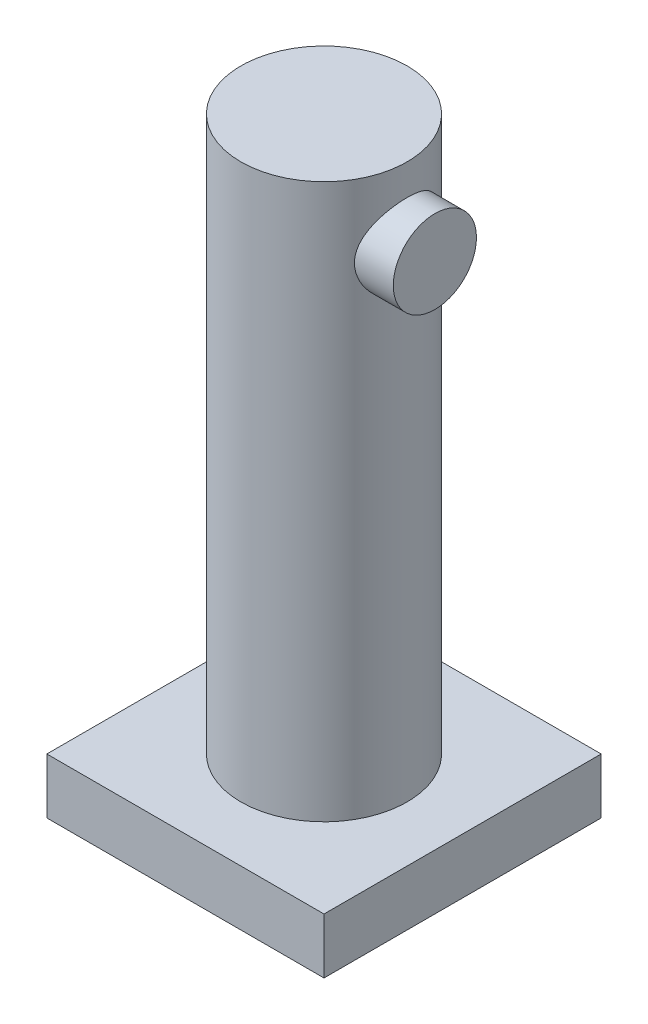
ISO-10303-21;
HEADER;
FILE_DESCRIPTION(('STEP AP214'),'2;1');
FILE_NAME('part.step','',(''),(''),'','','');
FILE_SCHEMA(('AUTOMOTIVE_DESIGN { 1 0 10303 214 1 1 1 1 }'));
ENDSEC;
DATA;
#1=APPLICATION_CONTEXT('core data for automotive mechanical design processes');
#2=APPLICATION_PROTOCOL_DEFINITION('international standard','automotive_design',2000,#1);
#3=PRODUCT_CONTEXT('',#1,'mechanical');
#4=PRODUCT('Part','Part','',(#3));
#5=PRODUCT_RELATED_PRODUCT_CATEGORY('part','',(#4));
#6=PRODUCT_DEFINITION_FORMATION('','',#4);
#7=PRODUCT_DEFINITION_CONTEXT('part definition',#1,'design');
#8=PRODUCT_DEFINITION('design','',#6,#7);
#9=PRODUCT_DEFINITION_SHAPE('','',#8);
#10=(LENGTH_UNIT() NAMED_UNIT(*) SI_UNIT(.MILLI.,.METRE.));
#11=(NAMED_UNIT(*) PLANE_ANGLE_UNIT() SI_UNIT($,.RADIAN.));
#12=(NAMED_UNIT(*) SI_UNIT($,.STERADIAN.) SOLID_ANGLE_UNIT());
#13=UNCERTAINTY_MEASURE_WITH_UNIT(LENGTH_MEASURE(1.E-05),#10,'distance_accuracy_value','');
#14=(GEOMETRIC_REPRESENTATION_CONTEXT(3) GLOBAL_UNCERTAINTY_ASSIGNED_CONTEXT((#13)) GLOBAL_UNIT_ASSIGNED_CONTEXT((#10,
#11,#12)) REPRESENTATION_CONTEXT('',''));
#15=CARTESIAN_POINT('',(0.,0.,0.));
#16=DIRECTION('',(0.,0.,1.));
#17=DIRECTION('',(1.,0.,0.));
#18=AXIS2_PLACEMENT_3D('',#15,#16,#17);
#19=CARTESIAN_POINT('',(0.,1100.,0.));
#20=DIRECTION('',(0.,-1.,0.));
#21=DIRECTION('',(0.,0.,-1.));
#22=AXIS2_PLACEMENT_3D('',#19,#20,#21);
#23=CYLINDRICAL_SURFACE('',#22,150.);
#24=CARTESIAN_POINT('',(0.,1100.,0.));
#25=DIRECTION('',(0.,1.,0.));
#26=DIRECTION('',(0.,0.,1.));
#27=AXIS2_PLACEMENT_3D('',#24,#25,#26);
#28=CIRCLE('',#27,150.);
#29=CARTESIAN_POINT('',(0.,1100.,150.));
#30=VERTEX_POINT('',#29);
#31=EDGE_CURVE('E111',#30,#30,#28,.T.);
#32=ORIENTED_EDGE('',*,*,#31,.F.);
#33=EDGE_LOOP('',(#32));
#34=FACE_BOUND('',#33,.T.);
#35=CARTESIAN_POINT('',(0.,100.,0.));
#36=DIRECTION('',(0.,1.,0.));
#37=DIRECTION('',(0.,0.,1.));
#38=AXIS2_PLACEMENT_3D('',#35,#36,#37);
#39=CIRCLE('',#38,150.);
#40=CARTESIAN_POINT('',(0.,100.,150.));
#41=VERTEX_POINT('',#40);
#42=EDGE_CURVE('E49',#41,#41,#39,.T.);
#43=ORIENTED_EDGE('',*,*,#42,.T.);
#44=EDGE_LOOP('',(#43));
#45=FACE_BOUND('',#44,.T.);
#46=CARTESIAN_POINT('',(129.903810567666,969.265591665348,75.));
#47=CARTESIAN_POINT('',(129.903811420839,968.288128942765,74.9999993006996));
#48=CARTESIAN_POINT('',(129.91485241894,967.310642365786,74.9808849071809));
#49=CARTESIAN_POINT('',(129.958914329319,965.357551628857,74.9044891493735));
#50=CARTESIAN_POINT('',(129.991937963204,964.381947716996,74.8472030591551));
#51=CARTESIAN_POINT('',(130.079664512874,962.434355564051,74.6946358539916));
#52=CARTESIAN_POINT('',(130.13437488093,961.462368681913,74.5993416781525));
#53=CARTESIAN_POINT('',(130.264962571577,959.524158889419,74.3710750303367));
#54=CARTESIAN_POINT('',(130.340842181223,958.55793661338,74.2380984872557));
#55=CARTESIAN_POINT('',(130.513207898603,956.631536287261,73.9346539235639));
#56=CARTESIAN_POINT('',(130.60972924554,955.671371501166,73.76412177368));
#57=CARTESIAN_POINT('',(130.822431351531,953.760420178277,73.3862278879793));
#58=CARTESIAN_POINT('',(130.938614186339,952.809634642922,73.1788622633673));
#59=CARTESIAN_POINT('',(131.189583523212,950.919364353117,72.7279846137554));
#60=CARTESIAN_POINT('',(131.324366065665,949.979877239551,72.4844802813395));
#61=CARTESIAN_POINT('',(131.611399522935,948.113491786094,71.9619913761846));
#62=CARTESIAN_POINT('',(131.763652185065,947.186594715811,71.6830032541549));
#63=CARTESIAN_POINT('',(132.243018022242,944.437005429077,70.7971366980788));
#64=CARTESIAN_POINT('',(132.594179272189,942.634747611969,70.138801162258));
#65=CARTESIAN_POINT('',(133.350018304579,939.095764729833,68.6908922584656));
#66=CARTESIAN_POINT('',(133.75469719945,937.359041027975,67.9013161624122));
#67=CARTESIAN_POINT('',(134.606257936416,933.95903166609,66.1971467617431));
#68=CARTESIAN_POINT('',(135.053136810067,932.295740852685,65.2825622484857));
#69=CARTESIAN_POINT('',(135.977643754193,929.049407385243,63.3343728211863));
#70=CARTESIAN_POINT('',(136.455273203206,927.46636833456,62.3007625696187));
#71=CARTESIAN_POINT('',(137.470149186955,924.259564023414,60.0302335597321));
#72=CARTESIAN_POINT('',(138.009063183983,922.643214350339,58.7835767196959));
#73=CARTESIAN_POINT('',(139.095560046539,919.519030956904,56.1643583824486));
#74=CARTESIAN_POINT('',(139.643143300329,918.011202113634,54.7917912329366));
#75=CARTESIAN_POINT('',(140.7336068061,915.110674223823,51.9268950431188));
#76=CARTESIAN_POINT('',(141.276484716471,913.718029849997,50.434509785529));
#77=CARTESIAN_POINT('',(142.344221581152,911.055933750404,47.3371372250203));
#78=CARTESIAN_POINT('',(142.869080004047,909.786485655826,45.7321466054791));
#79=CARTESIAN_POINT('',(143.650453834485,907.940300220463,43.1903343474534));
#80=CARTESIAN_POINT('',(143.918026622401,907.31645971735,42.290732937704));
#81=CARTESIAN_POINT('',(144.442562333303,906.107452590185,40.4629421299651));
#82=CARTESIAN_POINT('',(144.699526265663,905.522282283683,39.5347554664423));
#83=CARTESIAN_POINT('',(145.201087432756,904.391772239355,37.6509567952819));
#84=CARTESIAN_POINT('',(145.445682469921,903.846439571839,36.6953399611061));
#85=CARTESIAN_POINT('',(145.920690289304,902.797052237367,34.7583990954472));
#86=CARTESIAN_POINT('',(146.151104721666,902.292992765337,33.7770780740826));
#87=CARTESIAN_POINT('',(146.596025718433,901.327544651365,31.7905787334274));
#88=CARTESIAN_POINT('',(146.810537924642,900.866140861514,30.7854090438773));
#89=CARTESIAN_POINT('',(147.222130345961,899.987121180653,28.7527299066442));
#90=CARTESIAN_POINT('',(147.41921251679,899.569500376045,27.7252229814447));
#91=CARTESIAN_POINT('',(147.794471295791,898.779233588954,25.649685822657));
#92=CARTESIAN_POINT('',(147.972648369052,898.406586500031,24.6016560947066));
#93=CARTESIAN_POINT('',(148.308716863825,897.707437105241,22.4871176814895));
#94=CARTESIAN_POINT('',(148.466608671208,897.380933921604,21.4206093481643));
#95=CARTESIAN_POINT('',(148.750387003373,896.796715065084,19.3478027565578));
#96=CARTESIAN_POINT('',(148.87775136481,896.53575811875,18.3426191770829));
#97=CARTESIAN_POINT('',(149.113010819645,896.055388391094,16.3201223868786));
#98=CARTESIAN_POINT('',(149.220906207034,895.83597498244,15.3028093595579));
#99=CARTESIAN_POINT('',(149.416458567462,895.439391351264,13.2580792917326));
#100=CARTESIAN_POINT('',(149.504116103442,895.26221995372,12.2306625331057));
#101=CARTESIAN_POINT('',(149.658564083112,894.95069337492,10.1677924046223));
#102=CARTESIAN_POINT('',(149.725354479558,894.816338290603,9.13233901657573));
#103=CARTESIAN_POINT('',(149.837551172509,894.590955462637,7.05609999313428));
#104=CARTESIAN_POINT('',(149.882968213649,894.499905948527,6.01531730343289));
#105=CARTESIAN_POINT('',(149.952132861187,894.361347748468,3.93014213509433));
#106=CARTESIAN_POINT('',(149.97588057838,894.313838839897,2.88574967494128));
#107=CARTESIAN_POINT('',(150.001530428331,894.262527581539,0.795674738534314));
#108=CARTESIAN_POINT('',(150.003433604668,894.25872314386,-0.250007673707879));
#109=CARTESIAN_POINT('',(149.985382365556,894.294829497401,-2.3404156093167));
#110=CARTESIAN_POINT('',(149.965428367805,894.334739453226,-3.38514115058755));
#111=CARTESIAN_POINT('',(149.906499256737,894.45275283254,-5.38043204267112));
#112=CARTESIAN_POINT('',(149.869333498736,894.52722434949,-6.33126819770666));
#113=CARTESIAN_POINT('',(149.777140386739,894.712266941762,-8.22863180203203));
#114=CARTESIAN_POINT('',(149.722111615499,894.822840881437,-9.17515890339955));
#115=CARTESIAN_POINT('',(149.594539236115,895.079753419329,-11.0619980855576));
#116=CARTESIAN_POINT('',(149.52199847742,895.226086199122,-12.0023111519133));
#117=CARTESIAN_POINT('',(149.359829218643,895.554134607005,-13.8753447133122));
#118=CARTESIAN_POINT('',(149.270199105207,895.735853575835,-14.8080644828192));
#119=CARTESIAN_POINT('',(149.074392749456,896.134170997263,-16.6642171670034));
#120=CARTESIAN_POINT('',(148.968217637661,896.350767066745,-17.5876507116218));
#121=CARTESIAN_POINT('',(148.739945793449,896.818280294868,-19.4238262458942));
#122=CARTESIAN_POINT('',(148.617847593981,897.069200616032,-20.3365672419495));
#123=CARTESIAN_POINT('',(148.228710708302,897.87251482123,-23.0564746606206));
#124=CARTESIAN_POINT('',(147.93878561801,898.475551004323,-24.8457393914578));
#125=CARTESIAN_POINT('',(147.300152780169,899.820006322564,-28.3893046422761));
#126=CARTESIAN_POINT('',(146.950691055711,900.563215480683,-30.1427852443822));
#127=CARTESIAN_POINT('',(146.20357661752,902.176124740693,-33.5798586506784));
#128=CARTESIAN_POINT('',(145.805923961518,903.045824691051,-35.2634515385892));
#129=CARTESIAN_POINT('',(144.970832489177,904.905413428432,-38.5530636142519));
#130=CARTESIAN_POINT('',(144.533383364195,905.895333378901,-40.1590625366288));
#131=CARTESIAN_POINT('',(143.627848069227,907.988766948573,-43.2861572115245));
#132=CARTESIAN_POINT('',(143.159760205026,909.092286851386,-44.8072482603084));
#133=CARTESIAN_POINT('',(142.1572050138,911.516122456239,-47.8979343053814));
#134=CARTESIAN_POINT('',(141.62064630425,912.84707114549,-49.4585147702465));
#135=CARTESIAN_POINT('',(140.535165645227,915.630024497265,-52.4635033765368));
#136=CARTESIAN_POINT('',(139.986242993609,917.082036047628,-53.9079048987942));
#137=CARTESIAN_POINT('',(139.163709531499,919.345331178502,-55.9822883362665));
#138=CARTESIAN_POINT('',(138.889541685707,920.114366631124,-56.6586830471435));
#139=CARTESIAN_POINT('',(138.343269117666,921.679898276794,-57.9797425094769));
#140=CARTESIAN_POINT('',(138.071164231567,922.476392260477,-58.6244098036937));
#141=CARTESIAN_POINT('',(137.530797273352,924.095880760468,-59.8811124923251));
#142=CARTESIAN_POINT('',(137.262534894755,924.91887314605,-60.493150499989));
#143=CARTESIAN_POINT('',(136.731559778616,926.590681172206,-61.6839180695288));
#144=CARTESIAN_POINT('',(136.468848785427,927.439504730861,-62.2626372576679));
#145=CARTESIAN_POINT('',(135.658951143713,930.132456511824,-64.0185790631111));
#146=CARTESIAN_POINT('',(135.124751332001,932.020434099893,-65.1354642285907));
#147=CARTESIAN_POINT('',(134.107808540743,935.897922524617,-67.2043585944111));
#148=CARTESIAN_POINT('',(133.625061047661,937.887424432604,-68.1563822614322));
#149=CARTESIAN_POINT('',(132.952969847713,940.937574762758,-69.4531802579167));
#150=CARTESIAN_POINT('',(132.737646309605,941.965077359213,-69.8635092622733));
#151=CARTESIAN_POINT('',(132.326389703009,944.040462828172,-70.6393619278462));
#152=CARTESIAN_POINT('',(132.130451682431,945.088340413557,-71.0048970375225));
#153=CARTESIAN_POINT('',(131.759961913644,947.202704647578,-71.6900559665243));
#154=CARTESIAN_POINT('',(131.585409988262,948.269191141963,-72.0096801662052));
#155=CARTESIAN_POINT('',(131.259574101318,950.418728504402,-72.601918051135));
#156=CARTESIAN_POINT('',(131.108291175863,951.501780107696,-72.8745296431044));
#157=CARTESIAN_POINT('',(130.841722462814,953.595633336409,-73.3519757159068));
#158=CARTESIAN_POINT('',(130.724534204456,954.605359926808,-73.5604690504886));
#159=CARTESIAN_POINT('',(130.512520108222,956.634825878114,-73.9359765136339));
#160=CARTESIAN_POINT('',(130.417693934821,957.65456508855,-74.10299126455));
#161=CARTESIAN_POINT('',(130.251384466566,959.701906109247,-74.3949264518121));
#162=CARTESIAN_POINT('',(130.179900229588,960.729507600457,-74.5198485870971));
#163=CARTESIAN_POINT('',(130.061023832229,962.790394754196,-74.7271327674957));
#164=CARTESIAN_POINT('',(130.013631829819,963.823680453951,-74.8094945335443));
#165=CARTESIAN_POINT('',(129.943471564768,965.89299178965,-74.9312961505146));
#166=CARTESIAN_POINT('',(129.920688525537,966.929015406505,-74.9707617587655));
#167=CARTESIAN_POINT('',(129.899943048912,969.002054134476,-75.0067012424489));
#168=CARTESIAN_POINT('',(129.901980512932,970.039069241638,-75.0031752886427));
#169=CARTESIAN_POINT('',(129.930852425072,972.11165447273,-74.9531481105804));
#170=CARTESIAN_POINT('',(129.957685483489,973.147224674384,-74.9066492947967));
#171=CARTESIAN_POINT('',(130.035856139081,975.214608962457,-74.7708650971796));
#172=CARTESIAN_POINT('',(130.087193159424,976.246423136718,-74.6815807225323));
#173=CARTESIAN_POINT('',(130.206873168457,978.19116151631,-74.472699311696));
#174=CARTESIAN_POINT('',(130.272733905569,979.104715178319,-74.3575000933917));
#175=CARTESIAN_POINT('',(130.422894152729,980.925549265592,-74.0938034081047));
#176=CARTESIAN_POINT('',(130.507195058801,981.832829210533,-73.9453034200474));
#177=CARTESIAN_POINT('',(130.693532055843,983.639397997169,-73.6154642483153));
#178=CARTESIAN_POINT('',(130.79556490701,984.538688267163,-73.4341310633429));
#179=CARTESIAN_POINT('',(131.016560216568,986.328061578128,-73.0391126989387));
#180=CARTESIAN_POINT('',(131.135524233461,987.218143763403,-72.8254245411415));
#181=CARTESIAN_POINT('',(131.516512464333,989.872814834799,-72.1365629868607));
#182=CARTESIAN_POINT('',(131.802634679431,991.621845620061,-71.6135893253243));
#183=CARTESIAN_POINT('',(132.43070201112,995.067994449193,-70.4453554172057));
#184=CARTESIAN_POINT('',(132.772650533281,996.765109318533,-69.8000877099362));
#185=CARTESIAN_POINT('',(133.520064909555,1000.17682588851,-68.3599319288952));
#186=CARTESIAN_POINT('',(133.92773684509,1001.88860675861,-67.5595045926732));
#187=CARTESIAN_POINT('',(134.783033357614,1005.23906352991,-65.8366047099076));
#188=CARTESIAN_POINT('',(135.230658545203,1006.87773831326,-64.9141302980323));
#189=CARTESIAN_POINT('',(136.154877893386,1010.07607815055,-62.9525604899462));
#190=CARTESIAN_POINT('',(136.631483886747,1011.6357104487,-61.9134173096916));
#191=CARTESIAN_POINT('',(137.602460956672,1014.66936708995,-59.7243379130611));
#192=CARTESIAN_POINT('',(138.096833163871,1016.14338596897,-58.5743946375455));
#193=CARTESIAN_POINT('',(139.155394000352,1019.18049377093,-56.017181648615));
#194=CARTESIAN_POINT('',(139.720522310331,1020.73136001164,-54.5957503830836));
#195=CARTESIAN_POINT('',(140.844719819651,1023.70947864615,-51.6263984772894));
#196=CARTESIAN_POINT('',(141.403788548905,1025.13672150876,-50.0784681019732));
#197=CARTESIAN_POINT('',(142.501648258566,1027.85972751024,-46.8632822005354));
#198=CARTESIAN_POINT('',(143.040432027693,1029.15544416422,-45.195984839498));
#199=CARTESIAN_POINT('',(144.083768217989,1031.60628513072,-41.7505138440195));
#200=CARTESIAN_POINT('',(144.588320975944,1032.76141082655,-39.9723413007684));
#201=CARTESIAN_POINT('',(145.315861421488,1034.39581056213,-37.2054289770471));
#202=CARTESIAN_POINT('',(145.556395869901,1034.9304545172,-36.2535637629865));
#203=CARTESIAN_POINT('',(146.023280618496,1035.95898409456,-34.3247066823078));
#204=CARTESIAN_POINT('',(146.249632438487,1036.45287408584,-33.3477175238481));
#205=CARTESIAN_POINT('',(146.686565416146,1037.39872903995,-31.3700079194311));
#206=CARTESIAN_POINT('',(146.897144003659,1037.85068717308,-30.3692836408032));
#207=CARTESIAN_POINT('',(147.300928516947,1038.71131110427,-28.346081683747));
#208=CARTESIAN_POINT('',(147.494136525165,1039.11998209281,-27.3236066310984));
#209=CARTESIAN_POINT('',(147.861651023077,1039.89266349634,-25.2592685483778));
#210=CARTESIAN_POINT('',(148.035968451178,1040.25669977287,-24.2174171519366));
#211=CARTESIAN_POINT('',(148.364476639814,1040.93920887609,-22.1158986142347));
#212=CARTESIAN_POINT('',(148.518669792285,1041.25768711816,-21.0562336072011));
#213=CARTESIAN_POINT('',(148.805741860828,1041.84806439393,-18.921187960181));
#214=CARTESIAN_POINT('',(148.938621478591,1042.11996496109,-17.8458078388456));
#215=CARTESIAN_POINT('',(149.182008580697,1042.61624587189,-15.6816426019202));
#216=CARTESIAN_POINT('',(149.292516609903,1042.84062737287,-14.5928578134883));
#217=CARTESIAN_POINT('',(149.481181383244,1043.22266391462,-12.5048828448486));
#218=CARTESIAN_POINT('',(149.561377368531,1043.38455494764,-11.5066494718622));
#219=CARTESIAN_POINT('',(149.702042991037,1043.66798969283,-9.50299675765286));
#220=CARTESIAN_POINT('',(149.762511066129,1043.78953020992,-8.49757685381332));
#221=CARTESIAN_POINT('',(149.863289224374,1043.99184641956,-6.4817355564702));
#222=CARTESIAN_POINT('',(149.903601257663,1044.07262605582,-5.47131465637947));
#223=CARTESIAN_POINT('',(149.963796299466,1044.19317624352,-3.4474230522118));
#224=CARTESIAN_POINT('',(149.983679369128,1044.23294691771,-2.43395235727257));
#225=CARTESIAN_POINT('',(150.002875389509,1044.27134412202,-0.406287803033059));
#226=CARTESIAN_POINT('',(150.002193429707,1044.26998083206,0.607905815226961));
#227=CARTESIAN_POINT('',(149.980277758052,1044.22614180084,2.63508356119178));
#228=CARTESIAN_POINT('',(149.959046029151,1044.18367002633,3.64806779615328));
#229=CARTESIAN_POINT('',(149.89618127039,1044.05775790659,5.67087319215476));
#230=CARTESIAN_POINT('',(149.854547749392,1043.97431657507,6.68069427645845));
#231=CARTESIAN_POINT('',(149.751168133928,1043.76673569852,8.69509871264977));
#232=CARTESIAN_POINT('',(149.68942229776,1043.64259667616,9.69968213163528));
#233=CARTESIAN_POINT('',(149.550976182299,1043.36355476467,11.6354603819991));
#234=CARTESIAN_POINT('',(149.475533828629,1043.21122705543,12.5671178460302));
#235=CARTESIAN_POINT('',(149.307921122201,1042.87182157135,14.4226403532566));
#236=CARTESIAN_POINT('',(149.215749408473,1042.68474096925,15.346504756065));
#237=CARTESIAN_POINT('',(149.015233021385,1042.27635351715,17.18472822063));
#238=CARTESIAN_POINT('',(148.9068907803,1042.05505181431,18.099088689825));
#239=CARTESIAN_POINT('',(148.674652911247,1041.57876810792,19.9170243973033));
#240=CARTESIAN_POINT('',(148.550755867679,1041.32378303883,20.8205986457556));
#241=CARTESIAN_POINT('',(148.156759361913,1040.50920515541,23.5130199374932));
#242=CARTESIAN_POINT('',(147.86431879861,1039.89991744709,25.2838897441822));
#243=CARTESIAN_POINT('',(147.226409027996,1038.55459363558,28.7666639160575));
#244=CARTESIAN_POINT('',(146.880937345845,1037.81855161686,30.4785655247659));
#245=CARTESIAN_POINT('',(146.12852200702,1036.1915754358,33.9066972647406));
#246=CARTESIAN_POINT('',(145.719582701694,1035.29536740927,35.6199878655131));
#247=CARTESIAN_POINT('',(144.861079997418,1033.37851273783,38.9647187798572));
#248=CARTESIAN_POINT('',(144.41151583824,1032.3578637641,40.5961575608171));
#249=CARTESIAN_POINT('',(143.481305909894,1030.19862671897,43.7704423859271));
#250=CARTESIAN_POINT('',(143.000648908437,1029.05999593625,45.3132560299466));
#251=CARTESIAN_POINT('',(142.018488560039,1026.67148058204,48.3034693811376));
#252=CARTESIAN_POINT('',(141.516984125016,1025.42159019974,49.750864097926));
#253=CARTESIAN_POINT('',(140.731939655035,1023.40350479299,51.9152111721476));
#254=CARTESIAN_POINT('',(140.451889020941,1022.67170128541,52.6677192315939));
#255=CARTESIAN_POINT('',(139.890523330389,1021.17742051238,54.1411373162777));
#256=CARTESIAN_POINT('',(139.609208342214,1020.41494488618,54.8620490258822));
#257=CARTESIAN_POINT('',(139.047160072021,1018.86032838437,56.2713318377997));
#258=CARTESIAN_POINT('',(138.766426772221,1018.06818843003,56.9597039491808));
#259=CARTESIAN_POINT('',(138.207351318063,1016.4550453509,58.3031532534703));
#260=CARTESIAN_POINT('',(137.929009813739,1015.63403467034,58.9582216190547));
#261=CARTESIAN_POINT('',(137.100103382079,1013.12816158717,60.8727864143256));
#262=CARTESIAN_POINT('',(136.555987208157,1011.40136281234,62.080822234198));
#263=CARTESIAN_POINT('',(135.500860956102,1007.84492835465,64.3512597982747));
#264=CARTESIAN_POINT('',(134.989848984388,1006.01529856499,65.4136698762461));
#265=CARTESIAN_POINT('',(134.252428906517,1003.17118845133,66.9074497057645));
#266=CARTESIAN_POINT('',(134.007967580355,1002.19072033817,67.3953908181076));
#267=CARTESIAN_POINT('',(133.534307930151,1000.20648827606,68.3290757112612));
#268=CARTESIAN_POINT('',(133.30510606325,999.20272980803,68.7748292971476));
#269=CARTESIAN_POINT('',(132.864009956968,997.173058483248,69.6231536256339));
#270=CARTESIAN_POINT('',(132.652120577648,996.147139506967,70.0257122521639));
#271=CARTESIAN_POINT('',(132.247793753427,994.075093460919,70.7863447152779));
#272=CARTESIAN_POINT('',(132.055357251631,993.028965414309,71.1444163952587));
#273=CARTESIAN_POINT('',(131.692475105102,990.921586939313,71.8139024538368));
#274=CARTESIAN_POINT('',(131.521966577053,989.860389904497,72.1254506824915));
#275=CARTESIAN_POINT('',(131.204122602586,987.722015373941,72.7020400241799));
#276=CARTESIAN_POINT('',(131.056786680913,986.644838206438,72.9670820910371));
#277=CARTESIAN_POINT('',(130.78702151491,984.47744653064,73.4495157027663));
#278=CARTESIAN_POINT('',(130.664577740748,983.387240023519,73.6669350513374));
#279=CARTESIAN_POINT('',(130.445936673313,981.195828798888,74.0534063455545));
#280=CARTESIAN_POINT('',(130.349734892366,980.094625995298,74.2224665613917));
#281=CARTESIAN_POINT('',(130.207180473434,978.184873613616,74.4721736743716));
#282=CARTESIAN_POINT('',(130.154387040466,977.37828881998,74.5643601249559));
#283=CARTESIAN_POINT('',(130.063644241113,975.761926105976,74.7225321192482));
#284=CARTESIAN_POINT('',(130.02569086201,974.952149108677,74.7885247457833));
#285=CARTESIAN_POINT('',(129.964859513803,973.330253875125,74.8941853956415));
#286=CARTESIAN_POINT('',(129.941982673375,972.518135468157,74.9338514480774));
#287=CARTESIAN_POINT('',(129.911455860668,970.89254763458,74.9867624848767));
#288=CARTESIAN_POINT('',(129.903809857619,970.079077911075,75.0000005819877));
#289=CARTESIAN_POINT('',(129.903810567666,969.265591665348,75.));
#290=B_SPLINE_CURVE_WITH_KNOTS('',3,(#46,#47,#48,#49,#50,#51,#52,#53,#54,#55,#56,#57,#58,#59,
#60,#61,#62,#63,#64,#65,#66,#67,#68,#69,#70,#71,#72,#73,#74,#75,#76,#77,#78,#79,#80,#81,#82,#83,
#84,#85,#86,#87,#88,#89,#90,#91,#92,#93,#94,#95,#96,#97,#98,#99,#100,#101,#102,#103,#104,#105,
#106,#107,#108,#109,#110,#111,#112,#113,#114,#115,#116,#117,#118,#119,#120,#121,#122,#123,#124,
#125,#126,#127,#128,#129,#130,#131,#132,#133,#134,#135,#136,#137,#138,#139,#140,#141,#142,#143,
#144,#145,#146,#147,#148,#149,#150,#151,#152,#153,#154,#155,#156,#157,#158,#159,#160,#161,#162,
#163,#164,#165,#166,#167,#168,#169,#170,#171,#172,#173,#174,#175,#176,#177,#178,#179,#180,#181,
#182,#183,#184,#185,#186,#187,#188,#189,#190,#191,#192,#193,#194,#195,#196,#197,#198,#199,#200,
#201,#202,#203,#204,#205,#206,#207,#208,#209,#210,#211,#212,#213,#214,#215,#216,#217,#218,#219,
#220,#221,#222,#223,#224,#225,#226,#227,#228,#229,#230,#231,#232,#233,#234,#235,#236,#237,#238,
#239,#240,#241,#242,#243,#244,#245,#246,#247,#248,#249,#250,#251,#252,#253,#254,#255,#256,#257,
#258,#259,#260,#261,#262,#263,#264,#265,#266,#267,#268,#269,#270,#271,#272,#273,#274,#275,#276,
#277,#278,#279,#280,#281,#282,#283,#284,#285,#286,#287,#288,#289),.UNSPECIFIED.,.T.,.F.,(4,2,2,
2,2,2,2,2,2,2,2,2,2,2,2,2,2,2,2,2,2,2,2,2,2,2,2,2,2,2,2,2,2,2,2,2,2,2,2,2,2,2,2,2,2,2,2,2,2,2,2,
2,2,2,2,2,2,2,2,2,2,2,2,2,2,2,2,2,2,2,2,2,2,2,2,2,2,2,2,2,2,2,2,2,2,2,2,2,2,2,2,2,2,2,2,2,2,2,2,
2,2,2,2,2,2,2,2,2,2,2,2,2,2,2,2,2,2,2,2,2,2,4),(0.,2.9321808857811,5.86472486403527,
8.79827743534298,11.7321470609006,14.6710658995021,17.610295207145,20.548899757399,
23.487798475134,29.3325102611193,35.1773435556261,41.021766016914,46.8664506644462,
53.1933467176907,59.5205269338297,65.8506933364307,72.1810462629438,75.5610445923949,
78.9407205892672,82.3209949548458,85.7008752238232,89.0795505798743,92.4578463531531,
95.8360589969374,99.2142073702126,102.352014637247,105.489774517709,108.627447106747,
111.765126799643,114.901227454975,118.037312075375,121.173246875132,124.309121747303,
127.171689508912,130.034484440721,132.896813868614,135.759413654411,138.621817924605,
141.484486105149,147.208549384263,153.01137816988,158.814200003899,164.618529269877,
170.42317976619,176.776720118001,183.13062219978,186.310636397551,189.490395320023,
192.669899194804,195.850387706063,202.614398070434,209.377814588351,212.75826649466,
216.137852612353,219.517410729775,222.897119286308,226.009031077206,229.120896173568,
232.232635654023,235.344395537651,238.45428590704,241.56416392403,244.673867654252,
247.783498184622,250.552122976555,253.320957441345,256.089286543065,258.857870632302,
264.394985668416,269.932438611323,275.725973413598,281.519596772799,287.315601743457,
293.111976225497,299.639596004737,306.167718607098,312.698140447937,319.228498029069,
322.581338803374,325.933819671012,329.286845622509,332.639469064333,335.990140710542,
339.340413738166,342.690576444205,346.040657546644,349.083014783406,352.125612866419,
355.16791651517,358.210211057717,361.251752692789,364.293000863213,367.334322249925,
370.375604579129,373.215903350693,376.05643329065,378.896536404916,381.736898176855,
387.416622441439,393.096611846339,399.019259493725,404.942017996731,410.866928175945,
416.792147980868,420.05054337322,423.308764852252,426.566885225936,429.825864725905,
436.347607850743,442.868977597907,446.234394676413,449.599027645808,452.964601932065,
456.330339308373,459.686198593878,463.041989043945,466.395815020555,469.749067095499,
472.18919527915,474.628663200324,477.068313726877,479.50859995515),.UNSPECIFIED.);
#291=CARTESIAN_POINT('',(129.903810567666,969.265591665348,75.));
#292=VERTEX_POINT('',#291);
#293=EDGE_CURVE('E11',#292,#292,#290,.T.);
#294=ORIENTED_EDGE('',*,*,#293,.F.);
#295=EDGE_LOOP('',(#294));
#296=FACE_BOUND('',#295,.T.);
#297=ADVANCED_FACE('F35',(#34,#45,#296),#23,.T.);
#298=CARTESIAN_POINT('',(250.,100.,-250.));
#299=DIRECTION('',(-1.,0.,0.));
#300=DIRECTION('',(0.,0.,1.));
#301=AXIS2_PLACEMENT_3D('',#298,#299,#300);
#302=PLANE('',#301);
#303=DIRECTION('',(0.,0.,-1.));
#304=VECTOR('',#303,1.);
#305=CARTESIAN_POINT('',(250.,0.,-250.));
#306=LINE('',#305,#304);
#307=CARTESIAN_POINT('',(250.,0.,250.));
#308=VERTEX_POINT('',#307);
#309=CARTESIAN_POINT('',(250.,0.,-250.));
#310=VERTEX_POINT('',#309);
#311=EDGE_CURVE('E108',#308,#310,#306,.T.);
#312=ORIENTED_EDGE('',*,*,#311,.T.);
#313=DIRECTION('',(0.,-1.,0.));
#314=VECTOR('',#313,1.);
#315=CARTESIAN_POINT('',(250.,100.,-250.));
#316=LINE('',#315,#314);
#317=CARTESIAN_POINT('',(250.,100.,-250.));
#318=VERTEX_POINT('',#317);
#319=EDGE_CURVE('E99',#318,#310,#316,.T.);
#320=ORIENTED_EDGE('',*,*,#319,.F.);
#321=DIRECTION('',(0.,0.,-1.));
#322=VECTOR('',#321,1.);
#323=CARTESIAN_POINT('',(250.,100.,-250.));
#324=LINE('',#323,#322);
#325=CARTESIAN_POINT('',(250.,100.,250.));
#326=VERTEX_POINT('',#325);
#327=EDGE_CURVE('E93',#326,#318,#324,.T.);
#328=ORIENTED_EDGE('',*,*,#327,.F.);
#329=DIRECTION('',(0.,-1.,0.));
#330=VECTOR('',#329,1.);
#331=CARTESIAN_POINT('',(250.,100.,250.));
#332=LINE('',#331,#330);
#333=EDGE_CURVE('E104',#326,#308,#332,.T.);
#334=ORIENTED_EDGE('',*,*,#333,.T.);
#335=EDGE_LOOP('',(#312,#320,#328,#334));
#336=FACE_BOUND('',#335,.T.);
#337=ADVANCED_FACE('F37',(#336),#302,.F.);
#338=CARTESIAN_POINT('',(-250.,100.,-250.));
#339=DIRECTION('',(0.,0.,1.));
#340=DIRECTION('',(1.,0.,0.));
#341=AXIS2_PLACEMENT_3D('',#338,#339,#340);
#342=PLANE('',#341);
#343=DIRECTION('',(-1.,0.,0.));
#344=VECTOR('',#343,1.);
#345=CARTESIAN_POINT('',(-250.,0.,-250.));
#346=LINE('',#345,#344);
#347=CARTESIAN_POINT('',(-250.,0.,-250.));
#348=VERTEX_POINT('',#347);
#349=EDGE_CURVE('E98',#310,#348,#346,.T.);
#350=ORIENTED_EDGE('',*,*,#349,.T.);
#351=DIRECTION('',(0.,-1.,0.));
#352=VECTOR('',#351,1.);
#353=CARTESIAN_POINT('',(-250.,100.,-250.));
#354=LINE('',#353,#352);
#355=CARTESIAN_POINT('',(-250.,100.,-250.));
#356=VERTEX_POINT('',#355);
#357=EDGE_CURVE('E96',#356,#348,#354,.T.);
#358=ORIENTED_EDGE('',*,*,#357,.F.);
#359=DIRECTION('',(-1.,0.,0.));
#360=VECTOR('',#359,1.);
#361=CARTESIAN_POINT('',(-250.,100.,-250.));
#362=LINE('',#361,#360);
#363=EDGE_CURVE('E88',#318,#356,#362,.T.);
#364=ORIENTED_EDGE('',*,*,#363,.F.);
#365=ORIENTED_EDGE('',*,*,#319,.T.);
#366=EDGE_LOOP('',(#350,#358,#364,#365));
#367=FACE_BOUND('',#366,.T.);
#368=ADVANCED_FACE('F97',(#367),#342,.F.);
#369=CARTESIAN_POINT('',(-250.,100.,-250.));
#370=DIRECTION('',(1.,0.,0.));
#371=DIRECTION('',(0.,0.,-1.));
#372=AXIS2_PLACEMENT_3D('',#369,#370,#371);
#373=PLANE('',#372);
#374=DIRECTION('',(0.,0.,1.));
#375=VECTOR('',#374,1.);
#376=CARTESIAN_POINT('',(-250.,0.,-250.));
#377=LINE('',#376,#375);
#378=CARTESIAN_POINT('',(-250.,0.,250.));
#379=VERTEX_POINT('',#378);
#380=EDGE_CURVE('E74',#348,#379,#377,.T.);
#381=ORIENTED_EDGE('',*,*,#380,.T.);
#382=DIRECTION('',(0.,-1.,0.));
#383=VECTOR('',#382,1.);
#384=CARTESIAN_POINT('',(-250.,100.,250.));
#385=LINE('',#384,#383);
#386=CARTESIAN_POINT('',(-250.,100.,250.));
#387=VERTEX_POINT('',#386);
#388=EDGE_CURVE('E100',#387,#379,#385,.T.);
#389=ORIENTED_EDGE('',*,*,#388,.F.);
#390=DIRECTION('',(0.,0.,1.));
#391=VECTOR('',#390,1.);
#392=CARTESIAN_POINT('',(-250.,100.,-250.));
#393=LINE('',#392,#391);
#394=EDGE_CURVE('E91',#356,#387,#393,.T.);
#395=ORIENTED_EDGE('',*,*,#394,.F.);
#396=ORIENTED_EDGE('',*,*,#357,.T.);
#397=EDGE_LOOP('',(#381,#389,#395,#396));
#398=FACE_BOUND('',#397,.T.);
#399=ADVANCED_FACE('F102',(#398),#373,.F.);
#400=CARTESIAN_POINT('',(-250.,100.,250.));
#401=DIRECTION('',(0.,0.,-1.));
#402=DIRECTION('',(-1.,0.,0.));
#403=AXIS2_PLACEMENT_3D('',#400,#401,#402);
#404=PLANE('',#403);
#405=DIRECTION('',(1.,0.,0.));
#406=VECTOR('',#405,1.);
#407=CARTESIAN_POINT('',(-250.,0.,250.));
#408=LINE('',#407,#406);
#409=EDGE_CURVE('E80',#379,#308,#408,.T.);
#410=ORIENTED_EDGE('',*,*,#409,.T.);
#411=ORIENTED_EDGE('',*,*,#333,.F.);
#412=DIRECTION('',(1.,0.,0.));
#413=VECTOR('',#412,1.);
#414=CARTESIAN_POINT('',(-250.,100.,250.));
#415=LINE('',#414,#413);
#416=EDGE_CURVE('E57',#387,#326,#415,.T.);
#417=ORIENTED_EDGE('',*,*,#416,.F.);
#418=ORIENTED_EDGE('',*,*,#388,.T.);
#419=EDGE_LOOP('',(#410,#411,#417,#418));
#420=FACE_BOUND('',#419,.T.);
#421=ADVANCED_FACE('F150',(#420),#404,.F.);
#422=CARTESIAN_POINT('',(0.,100.,0.));
#423=DIRECTION('',(0.,1.,0.));
#424=DIRECTION('',(0.,0.,1.));
#425=AXIS2_PLACEMENT_3D('',#422,#423,#424);
#426=PLANE('',#425);
#427=ORIENTED_EDGE('',*,*,#42,.F.);
#428=EDGE_LOOP('',(#427));
#429=FACE_BOUND('',#428,.T.);
#430=ORIENTED_EDGE('',*,*,#327,.T.);
#431=ORIENTED_EDGE('',*,*,#363,.T.);
#432=ORIENTED_EDGE('',*,*,#394,.T.);
#433=ORIENTED_EDGE('',*,*,#416,.T.);
#434=EDGE_LOOP('',(#430,#431,#432,#433));
#435=FACE_BOUND('',#434,.T.);
#436=ADVANCED_FACE('F89',(#429,#435),#426,.T.);
#437=CARTESIAN_POINT('',(0.,0.,0.));
#438=DIRECTION('',(0.,1.,0.));
#439=DIRECTION('',(0.,0.,1.));
#440=AXIS2_PLACEMENT_3D('',#437,#438,#439);
#441=PLANE('',#440);
#442=ORIENTED_EDGE('',*,*,#311,.F.);
#443=ORIENTED_EDGE('',*,*,#409,.F.);
#444=ORIENTED_EDGE('',*,*,#380,.F.);
#445=ORIENTED_EDGE('',*,*,#349,.F.);
#446=EDGE_LOOP('',(#442,#443,#444,#445));
#447=FACE_BOUND('',#446,.T.);
#448=ADVANCED_FACE('F149',(#447),#441,.F.);
#449=CARTESIAN_POINT('',(0.,1100.,0.));
#450=DIRECTION('',(0.,1.,0.));
#451=DIRECTION('',(0.,0.,1.));
#452=AXIS2_PLACEMENT_3D('',#449,#450,#451);
#453=PLANE('',#452);
#454=ORIENTED_EDGE('',*,*,#31,.T.);
#455=EDGE_LOOP('',(#454));
#456=FACE_BOUND('',#455,.T.);
#457=ADVANCED_FACE('F132',(#456),#453,.T.);
#458=CARTESIAN_POINT('',(200.,969.265591665348,0.));
#459=DIRECTION('',(-1.,0.,0.));
#460=DIRECTION('',(0.,0.,1.));
#461=AXIS2_PLACEMENT_3D('',#458,#459,#460);
#462=CYLINDRICAL_SURFACE('',#461,75.);
#463=CARTESIAN_POINT('',(200.,969.265591665348,0.));
#464=DIRECTION('',(1.,0.,0.));
#465=DIRECTION('',(0.,0.,-1.));
#466=AXIS2_PLACEMENT_3D('',#463,#464,#465);
#467=CIRCLE('',#466,75.);
#468=CARTESIAN_POINT('',(200.,969.265591665348,-75.));
#469=VERTEX_POINT('',#468);
#470=EDGE_CURVE('E123',#469,#469,#467,.T.);
#471=ORIENTED_EDGE('',*,*,#470,.F.);
#472=EDGE_LOOP('',(#471));
#473=FACE_BOUND('',#472,.T.);
#474=ORIENTED_EDGE('',*,*,#293,.T.);
#475=EDGE_LOOP('',(#474));
#476=FACE_BOUND('',#475,.T.);
#477=ADVANCED_FACE('F129',(#473,#476),#462,.T.);
#478=CARTESIAN_POINT('',(200.,969.265591665348,0.));
#479=DIRECTION('',(1.,0.,0.));
#480=DIRECTION('',(0.,0.,-1.));
#481=AXIS2_PLACEMENT_3D('',#478,#479,#480);
#482=PLANE('',#481);
#483=ORIENTED_EDGE('',*,*,#470,.T.);
#484=EDGE_LOOP('',(#483));
#485=FACE_BOUND('',#484,.T.);
#486=ADVANCED_FACE('F127',(#485),#482,.T.);
#487=CLOSED_SHELL('',(#297,#337,#368,#399,#421,#436,#448,#457,#477,#486));
#488=MANIFOLD_SOLID_BREP('B2',#487);
#489=ADVANCED_BREP_SHAPE_REPRESENTATION('',(#18,#488),#14);
#490=SHAPE_DEFINITION_REPRESENTATION(#9,#489);
ENDSEC;
END-ISO-10303-21;
